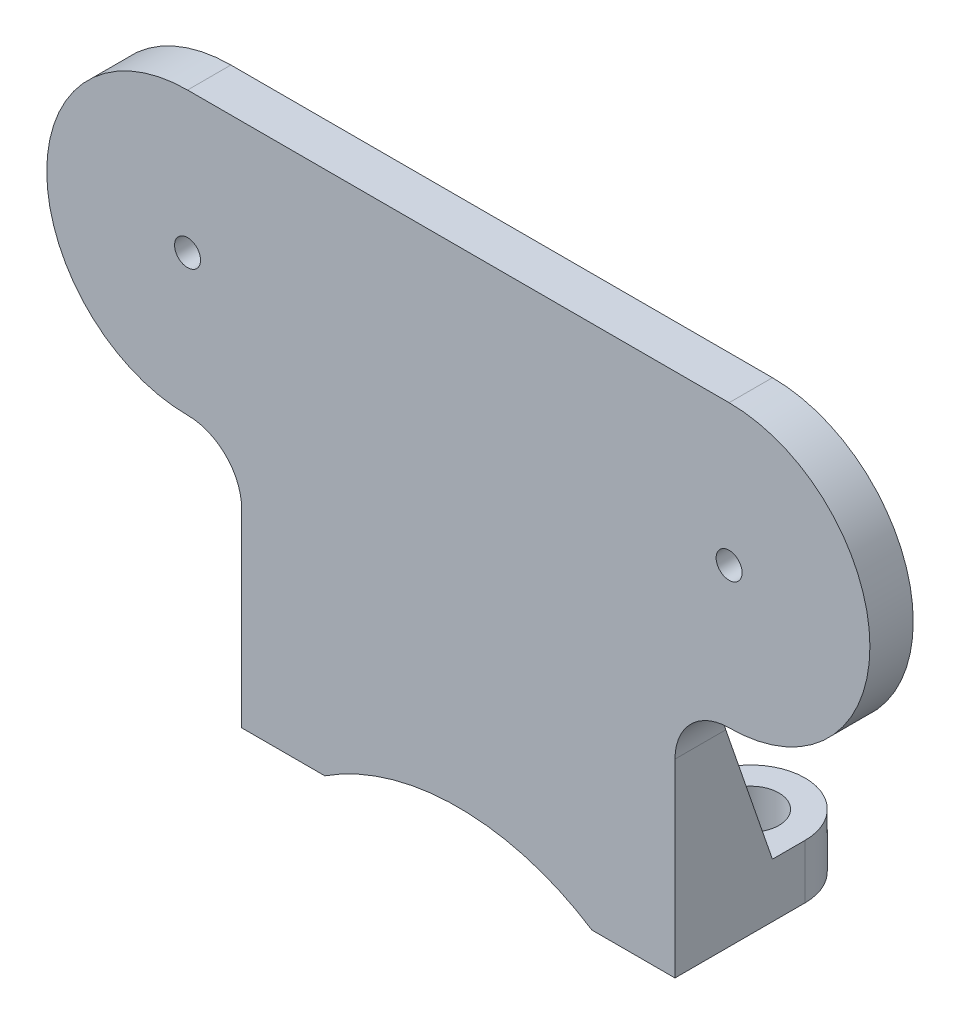
ISO-10303-21;
HEADER;
FILE_DESCRIPTION(('STEP AP214'),'2;1');
FILE_NAME('part.step','',(''),(''),'','','');
FILE_SCHEMA(('AUTOMOTIVE_DESIGN { 1 0 10303 214 1 1 1 1 }'));
ENDSEC;
DATA;
#1=APPLICATION_CONTEXT('core data for automotive mechanical design processes');
#2=APPLICATION_PROTOCOL_DEFINITION('international standard','automotive_design',2000,#1);
#3=PRODUCT_CONTEXT('',#1,'mechanical');
#4=PRODUCT('Part','Part','',(#3));
#5=PRODUCT_RELATED_PRODUCT_CATEGORY('part','',(#4));
#6=PRODUCT_DEFINITION_FORMATION('','',#4);
#7=PRODUCT_DEFINITION_CONTEXT('part definition',#1,'design');
#8=PRODUCT_DEFINITION('design','',#6,#7);
#9=PRODUCT_DEFINITION_SHAPE('','',#8);
#10=(LENGTH_UNIT() NAMED_UNIT(*) SI_UNIT(.MILLI.,.METRE.));
#11=(NAMED_UNIT(*) PLANE_ANGLE_UNIT() SI_UNIT($,.RADIAN.));
#12=(NAMED_UNIT(*) SI_UNIT($,.STERADIAN.) SOLID_ANGLE_UNIT());
#13=UNCERTAINTY_MEASURE_WITH_UNIT(LENGTH_MEASURE(1.E-05),#10,'distance_accuracy_value','');
#14=(GEOMETRIC_REPRESENTATION_CONTEXT(3) GLOBAL_UNCERTAINTY_ASSIGNED_CONTEXT((#13)) GLOBAL_UNIT_ASSIGNED_CONTEXT((#10,
#11,#12)) REPRESENTATION_CONTEXT('',''));
#15=CARTESIAN_POINT('',(0.,0.,0.));
#16=DIRECTION('',(0.,0.,1.));
#17=DIRECTION('',(1.,0.,0.));
#18=AXIS2_PLACEMENT_3D('',#15,#16,#17);
#19=CARTESIAN_POINT('',(-25.,0.,0.));
#20=DIRECTION('',(0.,0.,1.));
#21=DIRECTION('',(1.,0.,0.));
#22=AXIS2_PLACEMENT_3D('',#19,#20,#21);
#23=PLANE('',#22);
#24=CARTESIAN_POINT('',(-25.,0.,0.));
#25=DIRECTION('',(0.,0.,1.));
#26=DIRECTION('',(1.,0.,0.));
#27=AXIS2_PLACEMENT_3D('',#24,#25,#26);
#28=CIRCLE('',#27,1.2);
#29=CARTESIAN_POINT('',(-23.8,0.,0.));
#30=VERTEX_POINT('',#29);
#31=EDGE_CURVE('E497',#30,#30,#28,.T.);
#32=ORIENTED_EDGE('',*,*,#31,.T.);
#33=EDGE_LOOP('',(#32));
#34=FACE_BOUND('',#33,.T.);
#35=CARTESIAN_POINT('',(25.,0.,0.));
#36=DIRECTION('',(0.,0.,1.));
#37=DIRECTION('',(1.,0.,0.));
#38=AXIS2_PLACEMENT_3D('',#35,#36,#37);
#39=CIRCLE('',#38,1.2);
#40=CARTESIAN_POINT('',(26.2,0.,0.));
#41=VERTEX_POINT('',#40);
#42=EDGE_CURVE('E503',#41,#41,#39,.T.);
#43=ORIENTED_EDGE('',*,*,#42,.T.);
#44=EDGE_LOOP('',(#43));
#45=FACE_BOUND('',#44,.T.);
#46=DIRECTION('',(0.,1.,0.));
#47=VECTOR('',#46,1.);
#48=CARTESIAN_POINT('',(-12.,-16.,0.));
#49=LINE('',#48,#47);
#50=CARTESIAN_POINT('',(-12.,-27.5,0.));
#51=VERTEX_POINT('',#50);
#52=CARTESIAN_POINT('',(-12.,-16.,0.));
#53=VERTEX_POINT('',#52);
#54=EDGE_CURVE('E238',#51,#53,#49,.T.);
#55=ORIENTED_EDGE('',*,*,#54,.F.);
#56=DIRECTION('',(1.,0.,0.));
#57=VECTOR('',#56,1.);
#58=CARTESIAN_POINT('',(-18.,-27.5,0.));
#59=LINE('',#58,#57);
#60=CARTESIAN_POINT('',(-18.,-27.5,0.));
#61=VERTEX_POINT('',#60);
#62=EDGE_CURVE('E449',#51,#61,#59,.F.);
#63=ORIENTED_EDGE('',*,*,#62,.T.);
#64=DIRECTION('',(0.,-1.,0.));
#65=VECTOR('',#64,1.);
#66=CARTESIAN_POINT('',(-18.,-30.5,0.));
#67=LINE('',#66,#65);
#68=CARTESIAN_POINT('',(-18.,-16.,0.));
#69=VERTEX_POINT('',#68);
#70=EDGE_CURVE('E251',#69,#61,#67,.T.);
#71=ORIENTED_EDGE('',*,*,#70,.F.);
#72=DIRECTION('',(-1.,0.,0.));
#73=VECTOR('',#72,1.);
#74=CARTESIAN_POINT('',(-18.,-16.,0.));
#75=LINE('',#74,#73);
#76=CARTESIAN_POINT('',(-20.4174243050441,-16.,0.));
#77=VERTEX_POINT('',#76);
#78=EDGE_CURVE('E62',#69,#77,#75,.T.);
#79=ORIENTED_EDGE('',*,*,#78,.T.);
#80=CARTESIAN_POINT('',(-25.,-18.,0.));
#81=DIRECTION('',(0.,0.,1.));
#82=DIRECTION('',(1.,0.,0.));
#83=AXIS2_PLACEMENT_3D('',#80,#81,#82);
#84=CIRCLE('',#83,5.);
#85=CARTESIAN_POINT('',(-25.,-13.,0.));
#86=VERTEX_POINT('',#85);
#87=EDGE_CURVE('E420',#77,#86,#84,.T.);
#88=ORIENTED_EDGE('',*,*,#87,.T.);
#89=CARTESIAN_POINT('',(-25.,0.,0.));
#90=DIRECTION('',(0.,0.,1.));
#91=DIRECTION('',(1.,0.,0.));
#92=AXIS2_PLACEMENT_3D('',#89,#90,#91);
#93=CIRCLE('',#92,13.);
#94=CARTESIAN_POINT('',(-25.,13.,0.));
#95=VERTEX_POINT('',#94);
#96=EDGE_CURVE('E481',#95,#86,#93,.T.);
#97=ORIENTED_EDGE('',*,*,#96,.F.);
#98=DIRECTION('',(-1.,0.,0.));
#99=VECTOR('',#98,1.);
#100=CARTESIAN_POINT('',(-25.,13.,0.));
#101=LINE('',#100,#99);
#102=CARTESIAN_POINT('',(25.,13.,0.));
#103=VERTEX_POINT('',#102);
#104=EDGE_CURVE('E476',#103,#95,#101,.T.);
#105=ORIENTED_EDGE('',*,*,#104,.F.);
#106=CARTESIAN_POINT('',(25.,0.,0.));
#107=DIRECTION('',(0.,0.,1.));
#108=DIRECTION('',(-1.,0.,0.));
#109=AXIS2_PLACEMENT_3D('',#106,#107,#108);
#110=CIRCLE('',#109,13.);
#111=CARTESIAN_POINT('',(25.,-13.,0.));
#112=VERTEX_POINT('',#111);
#113=EDGE_CURVE('E479',#112,#103,#110,.T.);
#114=ORIENTED_EDGE('',*,*,#113,.F.);
#115=CARTESIAN_POINT('',(25.,-18.,0.));
#116=DIRECTION('',(0.,0.,1.));
#117=DIRECTION('',(1.,0.,0.));
#118=AXIS2_PLACEMENT_3D('',#115,#116,#117);
#119=CIRCLE('',#118,5.);
#120=CARTESIAN_POINT('',(20.4174243050442,-16.,0.));
#121=VERTEX_POINT('',#120);
#122=EDGE_CURVE('E419',#112,#121,#119,.T.);
#123=ORIENTED_EDGE('',*,*,#122,.T.);
#124=DIRECTION('',(1.,0.,0.));
#125=VECTOR('',#124,1.);
#126=CARTESIAN_POINT('',(18.,-16.,0.));
#127=LINE('',#126,#125);
#128=CARTESIAN_POINT('',(18.,-16.,0.));
#129=VERTEX_POINT('',#128);
#130=EDGE_CURVE('E54',#129,#121,#127,.T.);
#131=ORIENTED_EDGE('',*,*,#130,.F.);
#132=DIRECTION('',(0.,-1.,0.));
#133=VECTOR('',#132,1.);
#134=CARTESIAN_POINT('',(18.,-30.5,0.));
#135=LINE('',#134,#133);
#136=CARTESIAN_POINT('',(18.,-27.5,0.));
#137=VERTEX_POINT('',#136);
#138=EDGE_CURVE('E282',#129,#137,#135,.T.);
#139=ORIENTED_EDGE('',*,*,#138,.T.);
#140=DIRECTION('',(1.,0.,0.));
#141=VECTOR('',#140,1.);
#142=CARTESIAN_POINT('',(12.,-27.5,0.));
#143=LINE('',#142,#141);
#144=CARTESIAN_POINT('',(12.,-27.5,0.));
#145=VERTEX_POINT('',#144);
#146=EDGE_CURVE('E451',#137,#145,#143,.F.);
#147=ORIENTED_EDGE('',*,*,#146,.T.);
#148=DIRECTION('',(0.,1.,0.));
#149=VECTOR('',#148,1.);
#150=CARTESIAN_POINT('',(12.,-16.,0.));
#151=LINE('',#150,#149);
#152=CARTESIAN_POINT('',(12.,-16.,0.));
#153=VERTEX_POINT('',#152);
#154=EDGE_CURVE('E269',#145,#153,#151,.T.);
#155=ORIENTED_EDGE('',*,*,#154,.T.);
#156=DIRECTION('',(-1.,0.,0.));
#157=VECTOR('',#156,1.);
#158=CARTESIAN_POINT('',(12.,-16.,0.));
#159=LINE('',#158,#157);
#160=CARTESIAN_POINT('',(9.99999999999996,-16.,0.));
#161=VERTEX_POINT('',#160);
#162=EDGE_CURVE('E274',#153,#161,#159,.T.);
#163=ORIENTED_EDGE('',*,*,#162,.T.);
#164=DIRECTION('',(0.,-1.,0.));
#165=VECTOR('',#164,1.);
#166=CARTESIAN_POINT('',(9.99999999999996,-30.5,0.));
#167=LINE('',#166,#165);
#168=CARTESIAN_POINT('',(9.99999999999996,-34.1770449983276,0.));
#169=VERTEX_POINT('',#168);
#170=EDGE_CURVE('E506',#161,#169,#167,.T.);
#171=ORIENTED_EDGE('',*,*,#170,.T.);
#172=CARTESIAN_POINT('',(0.,-54.5,0.));
#173=DIRECTION('',(0.,0.,1.));
#174=DIRECTION('',(1.,0.,0.));
#175=AXIS2_PLACEMENT_3D('',#172,#173,#174);
#176=CIRCLE('',#175,22.65);
#177=CARTESIAN_POINT('',(-9.99999999999995,-34.1770449983276,0.));
#178=VERTEX_POINT('',#177);
#179=EDGE_CURVE('E311',#178,#169,#176,.F.);
#180=ORIENTED_EDGE('',*,*,#179,.F.);
#181=DIRECTION('',(0.,-1.,0.));
#182=VECTOR('',#181,1.);
#183=CARTESIAN_POINT('',(-9.99999999999996,-30.5,0.));
#184=LINE('',#183,#182);
#185=CARTESIAN_POINT('',(-9.99999999999996,-16.,0.));
#186=VERTEX_POINT('',#185);
#187=EDGE_CURVE('E533',#186,#178,#184,.T.);
#188=ORIENTED_EDGE('',*,*,#187,.F.);
#189=DIRECTION('',(1.,0.,0.));
#190=VECTOR('',#189,1.);
#191=CARTESIAN_POINT('',(-12.,-16.,0.));
#192=LINE('',#191,#190);
#193=EDGE_CURVE('E237',#53,#186,#192,.T.);
#194=ORIENTED_EDGE('',*,*,#193,.F.);
#195=EDGE_LOOP('',(#55,#63,#71,#79,#88,#97,#105,#114,#123,#131,#139,#147,#155,#163,#171,#180,
#188,#194));
#196=FACE_BOUND('',#195,.T.);
#197=ADVANCED_FACE('F39',(#34,#45,#196),#23,.F.);
#198=CARTESIAN_POINT('',(0.,-30.5,0.));
#199=DIRECTION('',(0.,-1.,0.));
#200=DIRECTION('',(0.,0.,-1.));
#201=AXIS2_PLACEMENT_3D('',#198,#199,#200);
#202=PLANE('',#201);
#203=CARTESIAN_POINT('',(-15.,-30.5,-7.99999999999997));
#204=DIRECTION('',(0.,-1.,0.));
#205=DIRECTION('',(0.,0.,-1.));
#206=AXIS2_PLACEMENT_3D('',#203,#204,#205);
#207=CIRCLE('',#206,2.59999999999995);
#208=CARTESIAN_POINT('',(-15.,-30.5,-10.5999999999999));
#209=VERTEX_POINT('',#208);
#210=EDGE_CURVE('E534',#209,#209,#207,.T.);
#211=ORIENTED_EDGE('',*,*,#210,.T.);
#212=EDGE_LOOP('',(#211));
#213=FACE_BOUND('',#212,.T.);
#214=DIRECTION('',(0.,0.,-1.));
#215=VECTOR('',#214,1.);
#216=CARTESIAN_POINT('',(-18.,-30.5,-5.));
#217=LINE('',#216,#215);
#218=CARTESIAN_POINT('',(-18.,-30.5,-3.));
#219=VERTEX_POINT('',#218);
#220=CARTESIAN_POINT('',(-18.,-30.5,-5.));
#221=VERTEX_POINT('',#220);
#222=EDGE_CURVE('E257',#219,#221,#217,.T.);
#223=ORIENTED_EDGE('',*,*,#222,.F.);
#224=DIRECTION('',(1.,0.,0.));
#225=VECTOR('',#224,1.);
#226=CARTESIAN_POINT('',(-12.,-30.5,-3.));
#227=LINE('',#226,#225);
#228=CARTESIAN_POINT('',(-12.,-30.5,-3.));
#229=VERTEX_POINT('',#228);
#230=EDGE_CURVE('E455',#219,#229,#227,.T.);
#231=ORIENTED_EDGE('',*,*,#230,.T.);
#232=DIRECTION('',(0.,0.,1.));
#233=VECTOR('',#232,1.);
#234=CARTESIAN_POINT('',(-12.,-30.5,0.));
#235=LINE('',#234,#233);
#236=CARTESIAN_POINT('',(-12.,-30.5,-5.));
#237=VERTEX_POINT('',#236);
#238=EDGE_CURVE('E233',#237,#229,#235,.T.);
#239=ORIENTED_EDGE('',*,*,#238,.F.);
#240=DIRECTION('',(1.,0.,0.));
#241=VECTOR('',#240,1.);
#242=CARTESIAN_POINT('',(-12.,-30.5,-5.));
#243=LINE('',#242,#241);
#244=CARTESIAN_POINT('',(-9.99999999999995,-30.5,-5.));
#245=VERTEX_POINT('',#244);
#246=EDGE_CURVE('E228',#237,#245,#243,.T.);
#247=ORIENTED_EDGE('',*,*,#246,.T.);
#248=DIRECTION('',(0.,0.,-1.));
#249=VECTOR('',#248,1.);
#250=CARTESIAN_POINT('',(-9.99999999999996,-30.5,0.));
#251=LINE('',#250,#249);
#252=CARTESIAN_POINT('',(-9.99999999999995,-30.5,-7.99999999999997));
#253=VERTEX_POINT('',#252);
#254=EDGE_CURVE('E212',#245,#253,#251,.T.);
#255=ORIENTED_EDGE('',*,*,#254,.T.);
#256=CARTESIAN_POINT('',(-15.,-30.5,-7.99999999999997));
#257=DIRECTION('',(0.,-1.,0.));
#258=DIRECTION('',(0.,0.,-1.));
#259=AXIS2_PLACEMENT_3D('',#256,#257,#258);
#260=CIRCLE('',#259,5.);
#261=CARTESIAN_POINT('',(-20.,-30.5,-7.99999999999997));
#262=VERTEX_POINT('',#261);
#263=EDGE_CURVE('E225',#253,#262,#260,.F.);
#264=ORIENTED_EDGE('',*,*,#263,.T.);
#265=DIRECTION('',(0.,0.,1.));
#266=VECTOR('',#265,1.);
#267=CARTESIAN_POINT('',(-20.,-30.5,-1.30104260698261E-13));
#268=LINE('',#267,#266);
#269=CARTESIAN_POINT('',(-20.,-30.5,-5.));
#270=VERTEX_POINT('',#269);
#271=EDGE_CURVE('E224',#262,#270,#268,.T.);
#272=ORIENTED_EDGE('',*,*,#271,.T.);
#273=DIRECTION('',(-1.,0.,0.));
#274=VECTOR('',#273,1.);
#275=CARTESIAN_POINT('',(-18.,-30.5,-5.));
#276=LINE('',#275,#274);
#277=EDGE_CURVE('E261',#221,#270,#276,.T.);
#278=ORIENTED_EDGE('',*,*,#277,.F.);
#279=EDGE_LOOP('',(#223,#231,#239,#247,#255,#264,#272,#278));
#280=FACE_BOUND('',#279,.T.);
#281=ADVANCED_FACE('F230',(#213,#280),#202,.F.);
#282=CARTESIAN_POINT('',(-25.,0.,4.));
#283=DIRECTION('',(0.,0.,1.));
#284=DIRECTION('',(1.,0.,0.));
#285=AXIS2_PLACEMENT_3D('',#282,#283,#284);
#286=PLANE('',#285);
#287=CARTESIAN_POINT('',(-25.,0.,4.));
#288=DIRECTION('',(0.,0.,1.));
#289=DIRECTION('',(1.,0.,0.));
#290=AXIS2_PLACEMENT_3D('',#287,#288,#289);
#291=CIRCLE('',#290,1.2);
#292=CARTESIAN_POINT('',(-23.8,0.,4.));
#293=VERTEX_POINT('',#292);
#294=EDGE_CURVE('E484',#293,#293,#291,.T.);
#295=ORIENTED_EDGE('',*,*,#294,.F.);
#296=EDGE_LOOP('',(#295));
#297=FACE_BOUND('',#296,.T.);
#298=CARTESIAN_POINT('',(25.,0.,4.));
#299=DIRECTION('',(0.,0.,1.));
#300=DIRECTION('',(1.,0.,0.));
#301=AXIS2_PLACEMENT_3D('',#298,#299,#300);
#302=CIRCLE('',#301,1.2);
#303=CARTESIAN_POINT('',(26.2,0.,4.));
#304=VERTEX_POINT('',#303);
#305=EDGE_CURVE('E500',#304,#304,#302,.T.);
#306=ORIENTED_EDGE('',*,*,#305,.F.);
#307=EDGE_LOOP('',(#306));
#308=FACE_BOUND('',#307,.T.);
#309=DIRECTION('',(1.,0.,0.));
#310=VECTOR('',#309,1.);
#311=CARTESIAN_POINT('',(-15.,-35.5,4.));
#312=LINE('',#311,#310);
#313=CARTESIAN_POINT('',(-20.,-35.5,4.));
#314=VERTEX_POINT('',#313);
#315=CARTESIAN_POINT('',(-12.329740467666,-35.5,4.));
#316=VERTEX_POINT('',#315);
#317=EDGE_CURVE('E490',#314,#316,#312,.T.);
#318=ORIENTED_EDGE('',*,*,#317,.T.);
#319=CARTESIAN_POINT('',(0.,-54.5,4.));
#320=DIRECTION('',(0.,0.,1.));
#321=DIRECTION('',(1.,0.,0.));
#322=AXIS2_PLACEMENT_3D('',#319,#320,#321);
#323=CIRCLE('',#322,22.65);
#324=CARTESIAN_POINT('',(12.329740467666,-35.5,4.));
#325=VERTEX_POINT('',#324);
#326=EDGE_CURVE('E293',#316,#325,#323,.F.);
#327=ORIENTED_EDGE('',*,*,#326,.T.);
#328=CARTESIAN_POINT('',(20.,-35.5,4.));
#329=VERTEX_POINT('',#328);
#330=EDGE_CURVE('E493',#325,#329,#312,.T.);
#331=ORIENTED_EDGE('',*,*,#330,.T.);
#332=DIRECTION('',(0.,1.,0.));
#333=VECTOR('',#332,1.);
#334=CARTESIAN_POINT('',(20.,-13.,4.));
#335=LINE('',#334,#333);
#336=CARTESIAN_POINT('',(20.,-18.,4.));
#337=VERTEX_POINT('',#336);
#338=EDGE_CURVE('E488',#329,#337,#335,.T.);
#339=ORIENTED_EDGE('',*,*,#338,.T.);
#340=CARTESIAN_POINT('',(25.,-18.,4.));
#341=DIRECTION('',(0.,0.,1.));
#342=DIRECTION('',(1.,0.,0.));
#343=AXIS2_PLACEMENT_3D('',#340,#341,#342);
#344=CIRCLE('',#343,5.);
#345=CARTESIAN_POINT('',(25.,-13.,4.));
#346=VERTEX_POINT('',#345);
#347=EDGE_CURVE('E11',#337,#346,#344,.F.);
#348=ORIENTED_EDGE('',*,*,#347,.T.);
#349=CARTESIAN_POINT('',(25.,0.,4.));
#350=DIRECTION('',(0.,0.,1.));
#351=DIRECTION('',(-1.,0.,0.));
#352=AXIS2_PLACEMENT_3D('',#349,#350,#351);
#353=CIRCLE('',#352,13.);
#354=CARTESIAN_POINT('',(25.,13.,4.));
#355=VERTEX_POINT('',#354);
#356=EDGE_CURVE('E486',#346,#355,#353,.T.);
#357=ORIENTED_EDGE('',*,*,#356,.T.);
#358=DIRECTION('',(-1.,0.,0.));
#359=VECTOR('',#358,1.);
#360=CARTESIAN_POINT('',(-25.,13.,4.));
#361=LINE('',#360,#359);
#362=CARTESIAN_POINT('',(-25.,13.,4.));
#363=VERTEX_POINT('',#362);
#364=EDGE_CURVE('E475',#355,#363,#361,.T.);
#365=ORIENTED_EDGE('',*,*,#364,.T.);
#366=CARTESIAN_POINT('',(-25.,0.,4.));
#367=DIRECTION('',(0.,0.,1.));
#368=DIRECTION('',(1.,0.,0.));
#369=AXIS2_PLACEMENT_3D('',#366,#367,#368);
#370=CIRCLE('',#369,13.);
#371=CARTESIAN_POINT('',(-25.,-13.,4.));
#372=VERTEX_POINT('',#371);
#373=EDGE_CURVE('E478',#363,#372,#370,.T.);
#374=ORIENTED_EDGE('',*,*,#373,.T.);
#375=CARTESIAN_POINT('',(-25.,-18.,4.));
#376=DIRECTION('',(0.,0.,1.));
#377=DIRECTION('',(1.,0.,0.));
#378=AXIS2_PLACEMENT_3D('',#375,#376,#377);
#379=CIRCLE('',#378,5.);
#380=CARTESIAN_POINT('',(-20.,-18.,4.));
#381=VERTEX_POINT('',#380);
#382=EDGE_CURVE('E411',#372,#381,#379,.F.);
#383=ORIENTED_EDGE('',*,*,#382,.T.);
#384=DIRECTION('',(0.,-1.,0.));
#385=VECTOR('',#384,1.);
#386=CARTESIAN_POINT('',(-20.,-13.,4.));
#387=LINE('',#386,#385);
#388=EDGE_CURVE('E494',#381,#314,#387,.T.);
#389=ORIENTED_EDGE('',*,*,#388,.T.);
#390=EDGE_LOOP('',(#318,#327,#331,#339,#348,#357,#365,#374,#383,#389));
#391=FACE_BOUND('',#390,.T.);
#392=ADVANCED_FACE('F363',(#297,#308,#391),#286,.T.);
#393=CARTESIAN_POINT('',(15.,-35.5,4.));
#394=DIRECTION('',(0.,1.,0.));
#395=DIRECTION('',(-1.,0.,0.));
#396=AXIS2_PLACEMENT_3D('',#393,#394,#395);
#397=PLANE('',#396);
#398=CARTESIAN_POINT('',(-15.,-35.5,-7.99999999999997));
#399=DIRECTION('',(0.,-1.,0.));
#400=DIRECTION('',(0.,0.,-1.));
#401=AXIS2_PLACEMENT_3D('',#398,#399,#400);
#402=CIRCLE('',#401,2.59999999999995);
#403=CARTESIAN_POINT('',(-15.,-35.5,-10.5999999999999));
#404=VERTEX_POINT('',#403);
#405=EDGE_CURVE('E538',#404,#404,#402,.T.);
#406=ORIENTED_EDGE('',*,*,#405,.F.);
#407=EDGE_LOOP('',(#406));
#408=FACE_BOUND('',#407,.T.);
#409=DIRECTION('',(0.,0.,1.));
#410=VECTOR('',#409,1.);
#411=CARTESIAN_POINT('',(-12.329740467666,-35.5,-13.));
#412=LINE('',#411,#410);
#413=CARTESIAN_POINT('',(-12.329740467666,-35.5,-12.2272584531797));
#414=VERTEX_POINT('',#413);
#415=EDGE_CURVE('E298',#414,#316,#412,.T.);
#416=ORIENTED_EDGE('',*,*,#415,.T.);
#417=ORIENTED_EDGE('',*,*,#317,.F.);
#418=DIRECTION('',(0.,0.,-1.));
#419=VECTOR('',#418,1.);
#420=CARTESIAN_POINT('',(-20.,-35.5,4.));
#421=LINE('',#420,#419);
#422=CARTESIAN_POINT('',(-20.,-35.5,-7.99999999999997));
#423=VERTEX_POINT('',#422);
#424=EDGE_CURVE('E460',#314,#423,#421,.T.);
#425=ORIENTED_EDGE('',*,*,#424,.T.);
#426=CARTESIAN_POINT('',(-15.,-35.5,-7.99999999999997));
#427=DIRECTION('',(0.,-1.,0.));
#428=DIRECTION('',(0.,0.,-1.));
#429=AXIS2_PLACEMENT_3D('',#426,#427,#428);
#430=CIRCLE('',#429,5.);
#431=EDGE_CURVE('E337',#414,#423,#430,.F.);
#432=ORIENTED_EDGE('',*,*,#431,.F.);
#433=EDGE_LOOP('',(#416,#417,#425,#432));
#434=FACE_BOUND('',#433,.T.);
#435=ADVANCED_FACE('F366',(#408,#434),#397,.F.);
#436=CARTESIAN_POINT('',(15.,-35.5,-7.99999999999998));
#437=DIRECTION('',(0.,-1.,0.));
#438=DIRECTION('',(0.,0.,-1.));
#439=AXIS2_PLACEMENT_3D('',#436,#437,#438);
#440=CIRCLE('',#439,2.59999999999995);
#441=CARTESIAN_POINT('',(15.,-35.5,-10.5999999999999));
#442=VERTEX_POINT('',#441);
#443=EDGE_CURVE('E520',#442,#442,#440,.T.);
#444=ORIENTED_EDGE('',*,*,#443,.F.);
#445=EDGE_LOOP('',(#444));
#446=FACE_BOUND('',#445,.T.);
#447=DIRECTION('',(0.,0.,1.));
#448=VECTOR('',#447,1.);
#449=CARTESIAN_POINT('',(12.329740467666,-35.5,-13.));
#450=LINE('',#449,#448);
#451=CARTESIAN_POINT('',(12.329740467666,-35.5,-12.2272584531797));
#452=VERTEX_POINT('',#451);
#453=EDGE_CURVE('E301',#452,#325,#450,.T.);
#454=ORIENTED_EDGE('',*,*,#453,.F.);
#455=CARTESIAN_POINT('',(15.,-35.5,-7.99999999999998));
#456=DIRECTION('',(0.,-1.,0.));
#457=DIRECTION('',(0.,0.,-1.));
#458=AXIS2_PLACEMENT_3D('',#455,#456,#457);
#459=CIRCLE('',#458,5.);
#460=CARTESIAN_POINT('',(20.,-35.5,-7.99999999999997));
#461=VERTEX_POINT('',#460);
#462=EDGE_CURVE('E517',#452,#461,#459,.T.);
#463=ORIENTED_EDGE('',*,*,#462,.T.);
#464=DIRECTION('',(0.,0.,-1.));
#465=VECTOR('',#464,1.);
#466=CARTESIAN_POINT('',(20.,-35.5,4.));
#467=LINE('',#466,#465);
#468=EDGE_CURVE('E463',#329,#461,#467,.T.);
#469=ORIENTED_EDGE('',*,*,#468,.F.);
#470=ORIENTED_EDGE('',*,*,#330,.F.);
#471=EDGE_LOOP('',(#454,#463,#469,#470));
#472=FACE_BOUND('',#471,.T.);
#473=ADVANCED_FACE('F348',(#446,#472),#397,.F.);
#474=CARTESIAN_POINT('',(9.99999999999996,-30.5,0.));
#475=DIRECTION('',(-1.,0.,0.));
#476=DIRECTION('',(0.,0.,1.));
#477=AXIS2_PLACEMENT_3D('',#474,#475,#476);
#478=PLANE('',#477);
#479=DIRECTION('',(0.,-1.,0.));
#480=VECTOR('',#479,1.);
#481=CARTESIAN_POINT('',(9.99999999999995,-30.5,-7.99999999999997));
#482=LINE('',#481,#480);
#483=CARTESIAN_POINT('',(9.99999999999995,-30.5,-7.99999999999997));
#484=VERTEX_POINT('',#483);
#485=CARTESIAN_POINT('',(9.99999999999995,-34.1770449983276,-7.99999999999997));
#486=VERTEX_POINT('',#485);
#487=EDGE_CURVE('E509',#484,#486,#482,.T.);
#488=ORIENTED_EDGE('',*,*,#487,.T.);
#489=DIRECTION('',(0.,0.,1.));
#490=VECTOR('',#489,1.);
#491=CARTESIAN_POINT('',(9.99999999999995,-34.1770449983276,-13.));
#492=LINE('',#491,#490);
#493=EDGE_CURVE('E338',#486,#169,#492,.T.);
#494=ORIENTED_EDGE('',*,*,#493,.T.);
#495=ORIENTED_EDGE('',*,*,#170,.F.);
#496=DIRECTION('',(0.,-0.945372981626273,-0.325990683319403));
#497=VECTOR('',#496,1.);
#498=CARTESIAN_POINT('',(9.99999999999995,-30.5,-5.));
#499=LINE('',#498,#497);
#500=CARTESIAN_POINT('',(9.99999999999995,-30.5,-5.));
#501=VERTEX_POINT('',#500);
#502=EDGE_CURVE('E264',#161,#501,#499,.T.);
#503=ORIENTED_EDGE('',*,*,#502,.T.);
#504=DIRECTION('',(0.,0.,-1.));
#505=VECTOR('',#504,1.);
#506=CARTESIAN_POINT('',(9.99999999999996,-30.5,0.));
#507=LINE('',#506,#505);
#508=EDGE_CURVE('E528',#501,#484,#507,.T.);
#509=ORIENTED_EDGE('',*,*,#508,.T.);
#510=EDGE_LOOP('',(#488,#494,#495,#503,#509));
#511=FACE_BOUND('',#510,.T.);
#512=ADVANCED_FACE('F343',(#511),#478,.T.);
#513=CARTESIAN_POINT('',(15.,-30.5,-7.99999999999998));
#514=DIRECTION('',(0.,-1.,0.));
#515=DIRECTION('',(0.,0.,-1.));
#516=AXIS2_PLACEMENT_3D('',#513,#514,#515);
#517=CYLINDRICAL_SURFACE('',#516,5.);
#518=ORIENTED_EDGE('',*,*,#462,.F.);
#519=CARTESIAN_POINT('',(12.329740467666,-35.5,-12.2272584531797));
#520=CARTESIAN_POINT('',(12.2225293587096,-35.4304160792958,-12.1595533242041));
#521=CARTESIAN_POINT('',(12.1168164568644,-35.3631159991764,-12.0870538373283));
#522=CARTESIAN_POINT('',(11.9093677369786,-35.2333363393609,-11.9325175155678));
#523=CARTESIAN_POINT('',(11.8076343095939,-35.1708596360003,-11.8504750618851));
#524=CARTESIAN_POINT('',(11.6089905048057,-35.0509031353264,-11.6767535996554));
#525=CARTESIAN_POINT('',(11.5120936885644,-34.9934370837892,-11.5850495177509));
#526=CARTESIAN_POINT('',(11.324536341671,-34.883956550203,-11.3924952280118));
#527=CARTESIAN_POINT('',(11.233874614534,-34.8319410212153,-11.291646783598));
#528=CARTESIAN_POINT('',(11.059483392532,-34.7333510552124,-11.0807679509366));
#529=CARTESIAN_POINT('',(10.9757864979267,-34.6868018279059,-10.9706987466644));
#530=CARTESIAN_POINT('',(10.8168302695518,-34.5995751387638,-10.7423442671521));
#531=CARTESIAN_POINT('',(10.7415749433503,-34.5589004632125,-10.6240551323589));
#532=CARTESIAN_POINT('',(10.6007455324804,-34.4836802417533,-10.3804014194787));
#533=CARTESIAN_POINT('',(10.5351484567578,-34.4491200995374,-10.2550546593192));
#534=CARTESIAN_POINT('',(10.4143749517426,-34.3861258372422,-9.9980469704045));
#535=CARTESIAN_POINT('',(10.35919277949,-34.3576883398046,-9.8663895719679));
#536=CARTESIAN_POINT('',(10.2592627612153,-34.3066042527945,-9.59578141945735));
#537=CARTESIAN_POINT('',(10.2146820768777,-34.284049952961,-9.4567513804151));
#538=CARTESIAN_POINT('',(10.1376973386246,-34.2453353721974,-9.17448731225828));
#539=CARTESIAN_POINT('',(10.1052934801008,-34.2291751938685,-9.03125321572428));
#540=CARTESIAN_POINT('',(10.0529653173175,-34.2031701644359,-8.74078826064109));
#541=CARTESIAN_POINT('',(10.0331407161336,-34.1933757538764,-8.59353488876485));
#542=CARTESIAN_POINT('',(10.0066377214013,-34.1803115894766,-8.29752430262395));
#543=CARTESIAN_POINT('',(9.99996288730794,-34.1770436022431,-8.14876669213286));
#544=CARTESIAN_POINT('',(10.,-34.1770449983276,-7.99999999999997));
#545=B_SPLINE_CURVE_WITH_KNOTS('',3,(#519,#520,#521,#522,#523,#524,#525,#526,#527,#528,#529,
#530,#531,#532,#533,#534,#535,#536,#537,#538,#539,#540,#541,#542,#543,#544),.UNSPECIFIED.,.F.,
.F.,(4,2,2,2,2,2,2,2,2,2,2,2,4),(0.,0.433861914551858,0.867980587969875,1.30325499011313,
1.73844563069135,2.17557042318189,2.61290186670019,3.04917481909605,3.48520649557289,
3.9277147964524,4.37023019760903,4.81621054617655,5.26231159870277),.UNSPECIFIED.);
#546=EDGE_CURVE('E329',#452,#486,#545,.T.);
#547=ORIENTED_EDGE('',*,*,#546,.T.);
#548=ORIENTED_EDGE('',*,*,#487,.F.);
#549=CARTESIAN_POINT('',(15.,-30.5,-7.99999999999998));
#550=DIRECTION('',(0.,-1.,0.));
#551=DIRECTION('',(0.,0.,-1.));
#552=AXIS2_PLACEMENT_3D('',#549,#550,#551);
#553=CIRCLE('',#552,5.);
#554=CARTESIAN_POINT('',(20.,-30.5,-7.99999999999997));
#555=VERTEX_POINT('',#554);
#556=EDGE_CURVE('E525',#484,#555,#553,.T.);
#557=ORIENTED_EDGE('',*,*,#556,.T.);
#558=DIRECTION('',(0.,-1.,0.));
#559=VECTOR('',#558,1.);
#560=CARTESIAN_POINT('',(20.,-30.5,-7.99999999999997));
#561=LINE('',#560,#559);
#562=EDGE_CURVE('E512',#555,#461,#561,.T.);
#563=ORIENTED_EDGE('',*,*,#562,.T.);
#564=EDGE_LOOP('',(#518,#547,#548,#557,#563));
#565=FACE_BOUND('',#564,.T.);
#566=ADVANCED_FACE('F339',(#565),#517,.T.);
#567=CARTESIAN_POINT('',(-15.,-30.5,-7.99999999999997));
#568=DIRECTION('',(0.,-1.,0.));
#569=DIRECTION('',(0.,0.,-1.));
#570=AXIS2_PLACEMENT_3D('',#567,#568,#569);
#571=CYLINDRICAL_SURFACE('',#570,5.);
#572=CARTESIAN_POINT('',(-12.329740467666,-35.5,-12.2272584531797));
#573=CARTESIAN_POINT('',(-12.2225293587095,-35.4304160792958,-12.1595533242041));
#574=CARTESIAN_POINT('',(-12.1168164568643,-35.3631159991764,-12.0870538373283));
#575=CARTESIAN_POINT('',(-11.9093677369785,-35.2333363393609,-11.9325175155678));
#576=CARTESIAN_POINT('',(-11.8076343095938,-35.1708596360003,-11.8504750618851));
#577=CARTESIAN_POINT('',(-11.6089905048056,-35.0509031353264,-11.6767535996554));
#578=CARTESIAN_POINT('',(-11.5120936885644,-34.9934370837892,-11.5850495177509));
#579=CARTESIAN_POINT('',(-11.3245363416709,-34.883956550203,-11.3924952280117));
#580=CARTESIAN_POINT('',(-11.2338746145339,-34.8319410212153,-11.291646783598));
#581=CARTESIAN_POINT('',(-11.0594833925319,-34.7333510552124,-11.0807679509366));
#582=CARTESIAN_POINT('',(-10.9757864979266,-34.686801827906,-10.9706987466644));
#583=CARTESIAN_POINT('',(-10.8168302695517,-34.5995751387638,-10.7423442671521));
#584=CARTESIAN_POINT('',(-10.7415749433502,-34.5589004632125,-10.6240551323589));
#585=CARTESIAN_POINT('',(-10.6007455324803,-34.4836802417533,-10.3804014194787));
#586=CARTESIAN_POINT('',(-10.5351484567578,-34.4491200995374,-10.2550546593191));
#587=CARTESIAN_POINT('',(-10.4143749517426,-34.3861258372423,-9.99804697040449));
#588=CARTESIAN_POINT('',(-10.3591927794899,-34.3576883398046,-9.86638957196789));
#589=CARTESIAN_POINT('',(-10.2592627612152,-34.3066042527945,-9.59578141945734));
#590=CARTESIAN_POINT('',(-10.2146820768777,-34.284049952961,-9.45675138041509));
#591=CARTESIAN_POINT('',(-10.1376973386245,-34.2453353721974,-9.17448731225827));
#592=CARTESIAN_POINT('',(-10.1052934801008,-34.2291751938685,-9.03125321572428));
#593=CARTESIAN_POINT('',(-10.0529653173174,-34.2031701644359,-8.74078826064109));
#594=CARTESIAN_POINT('',(-10.0331407161335,-34.1933757538764,-8.59353488876485));
#595=CARTESIAN_POINT('',(-10.0066377214013,-34.1803115894766,-8.29752430262395));
#596=CARTESIAN_POINT('',(-9.99996288730787,-34.1770436022431,-8.14876669213286));
#597=CARTESIAN_POINT('',(-9.99999999999995,-34.1770449983276,-7.99999999999997));
#598=B_SPLINE_CURVE_WITH_KNOTS('',3,(#572,#573,#574,#575,#576,#577,#578,#579,#580,#581,#582,
#583,#584,#585,#586,#587,#588,#589,#590,#591,#592,#593,#594,#595,#596,#597),.UNSPECIFIED.,.F.,
.F.,(4,2,2,2,2,2,2,2,2,2,2,2,4),(0.,0.433861914551856,0.867980587969874,1.30325499011312,
1.73844563069134,2.17557042318188,2.61290186670017,3.04917481909603,3.48520649557287,
3.92771479645238,4.370230197609,4.81621054617652,5.26231159870274),.UNSPECIFIED.);
#599=CARTESIAN_POINT('',(-9.99999999999995,-34.1770449983276,-7.99999999999997));
#600=VERTEX_POINT('',#599);
#601=EDGE_CURVE('E303',#414,#600,#598,.T.);
#602=ORIENTED_EDGE('',*,*,#601,.F.);
#603=ORIENTED_EDGE('',*,*,#431,.T.);
#604=DIRECTION('',(0.,-1.,0.));
#605=VECTOR('',#604,1.);
#606=CARTESIAN_POINT('',(-20.,-30.5,-7.99999999999997));
#607=LINE('',#606,#605);
#608=EDGE_CURVE('E523',#262,#423,#607,.T.);
#609=ORIENTED_EDGE('',*,*,#608,.F.);
#610=ORIENTED_EDGE('',*,*,#263,.F.);
#611=DIRECTION('',(0.,-1.,0.));
#612=VECTOR('',#611,1.);
#613=CARTESIAN_POINT('',(-9.99999999999995,-30.5,-7.99999999999997));
#614=LINE('',#613,#612);
#615=EDGE_CURVE('E220',#253,#600,#614,.T.);
#616=ORIENTED_EDGE('',*,*,#615,.T.);
#617=EDGE_LOOP('',(#602,#603,#609,#610,#616));
#618=FACE_BOUND('',#617,.T.);
#619=ADVANCED_FACE('F313',(#618),#571,.T.);
#620=CARTESIAN_POINT('',(-9.99999999999996,-30.5,0.));
#621=DIRECTION('',(-1.,0.,0.));
#622=DIRECTION('',(0.,0.,1.));
#623=AXIS2_PLACEMENT_3D('',#620,#621,#622);
#624=PLANE('',#623);
#625=DIRECTION('',(0.,0.,1.));
#626=VECTOR('',#625,1.);
#627=CARTESIAN_POINT('',(-9.99999999999995,-34.1770449983276,-13.));
#628=LINE('',#627,#626);
#629=EDGE_CURVE('E457',#600,#178,#628,.T.);
#630=ORIENTED_EDGE('',*,*,#629,.F.);
#631=ORIENTED_EDGE('',*,*,#615,.F.);
#632=ORIENTED_EDGE('',*,*,#254,.F.);
#633=DIRECTION('',(0.,-0.945372981626273,-0.325990683319403));
#634=VECTOR('',#633,1.);
#635=CARTESIAN_POINT('',(-9.99999999999995,-30.5,-5.));
#636=LINE('',#635,#634);
#637=EDGE_CURVE('E218',#186,#245,#636,.T.);
#638=ORIENTED_EDGE('',*,*,#637,.F.);
#639=ORIENTED_EDGE('',*,*,#187,.T.);
#640=EDGE_LOOP('',(#630,#631,#632,#638,#639));
#641=FACE_BOUND('',#640,.T.);
#642=ADVANCED_FACE('F215',(#641),#624,.F.);
#643=CARTESIAN_POINT('',(-25.,0.,4.));
#644=DIRECTION('',(0.,0.,-1.));
#645=DIRECTION('',(-1.,0.,0.));
#646=AXIS2_PLACEMENT_3D('',#643,#644,#645);
#647=CYLINDRICAL_SURFACE('',#646,13.);
#648=ORIENTED_EDGE('',*,*,#96,.T.);
#649=DIRECTION('',(0.,0.,-1.));
#650=VECTOR('',#649,1.);
#651=CARTESIAN_POINT('',(-25.,-13.,4.));
#652=LINE('',#651,#650);
#653=EDGE_CURVE('E414',#372,#86,#652,.T.);
#654=ORIENTED_EDGE('',*,*,#653,.F.);
#655=ORIENTED_EDGE('',*,*,#373,.F.);
#656=DIRECTION('',(0.,0.,-1.));
#657=VECTOR('',#656,1.);
#658=CARTESIAN_POINT('',(-25.,13.,4.));
#659=LINE('',#658,#657);
#660=EDGE_CURVE('E472',#363,#95,#659,.T.);
#661=ORIENTED_EDGE('',*,*,#660,.T.);
#662=EDGE_LOOP('',(#648,#654,#655,#661));
#663=FACE_BOUND('',#662,.T.);
#664=ADVANCED_FACE('F388',(#663),#647,.T.);
#665=CARTESIAN_POINT('',(-20.,-13.,4.));
#666=DIRECTION('',(1.,0.,0.));
#667=DIRECTION('',(0.,0.,-1.));
#668=AXIS2_PLACEMENT_3D('',#665,#666,#667);
#669=PLANE('',#668);
#670=ORIENTED_EDGE('',*,*,#388,.F.);
#671=DIRECTION('',(0.,0.,-1.));
#672=VECTOR('',#671,1.);
#673=CARTESIAN_POINT('',(-20.,-18.,0.));
#674=LINE('',#673,#672);
#675=CARTESIAN_POINT('',(-20.,-18.,-0.689655172413795));
#676=VERTEX_POINT('',#675);
#677=EDGE_CURVE('E416',#381,#676,#674,.T.);
#678=ORIENTED_EDGE('',*,*,#677,.T.);
#679=DIRECTION('',(0.,0.945372981626273,0.325990683319403));
#680=VECTOR('',#679,1.);
#681=CARTESIAN_POINT('',(-20.,-16.,0.));
#682=LINE('',#681,#680);
#683=EDGE_CURVE('E249',#270,#676,#682,.T.);
#684=ORIENTED_EDGE('',*,*,#683,.F.);
#685=ORIENTED_EDGE('',*,*,#271,.F.);
#686=ORIENTED_EDGE('',*,*,#608,.T.);
#687=ORIENTED_EDGE('',*,*,#424,.F.);
#688=EDGE_LOOP('',(#670,#678,#684,#685,#686,#687));
#689=FACE_BOUND('',#688,.T.);
#690=ADVANCED_FACE('F381',(#689),#669,.F.);
#691=CARTESIAN_POINT('',(20.,-13.,4.));
#692=DIRECTION('',(-1.,0.,0.));
#693=DIRECTION('',(0.,0.,1.));
#694=AXIS2_PLACEMENT_3D('',#691,#692,#693);
#695=PLANE('',#694);
#696=DIRECTION('',(0.,0.945372981626273,0.325990683319403));
#697=VECTOR('',#696,1.);
#698=CARTESIAN_POINT('',(20.,-16.,0.));
#699=LINE('',#698,#697);
#700=CARTESIAN_POINT('',(20.,-30.5,-5.));
#701=VERTEX_POINT('',#700);
#702=CARTESIAN_POINT('',(20.,-18.,-0.689655172413789));
#703=VERTEX_POINT('',#702);
#704=EDGE_CURVE('E279',#701,#703,#699,.T.);
#705=ORIENTED_EDGE('',*,*,#704,.T.);
#706=DIRECTION('',(0.,0.,-1.));
#707=VECTOR('',#706,1.);
#708=CARTESIAN_POINT('',(20.,-18.,4.));
#709=LINE('',#708,#707);
#710=EDGE_CURVE('E431',#703,#337,#709,.F.);
#711=ORIENTED_EDGE('',*,*,#710,.T.);
#712=ORIENTED_EDGE('',*,*,#338,.F.);
#713=ORIENTED_EDGE('',*,*,#468,.T.);
#714=ORIENTED_EDGE('',*,*,#562,.F.);
#715=DIRECTION('',(0.,0.,1.));
#716=VECTOR('',#715,1.);
#717=CARTESIAN_POINT('',(20.,-30.5,-1.30104260698261E-13));
#718=LINE('',#717,#716);
#719=EDGE_CURVE('E434',#555,#701,#718,.T.);
#720=ORIENTED_EDGE('',*,*,#719,.T.);
#721=EDGE_LOOP('',(#705,#711,#712,#713,#714,#720));
#722=FACE_BOUND('',#721,.T.);
#723=ADVANCED_FACE('F377',(#722),#695,.F.);
#724=CARTESIAN_POINT('',(25.,0.,4.));
#725=DIRECTION('',(0.,0.,-1.));
#726=DIRECTION('',(-1.,0.,0.));
#727=AXIS2_PLACEMENT_3D('',#724,#725,#726);
#728=CYLINDRICAL_SURFACE('',#727,13.);
#729=ORIENTED_EDGE('',*,*,#113,.T.);
#730=DIRECTION('',(0.,0.,-1.));
#731=VECTOR('',#730,1.);
#732=CARTESIAN_POINT('',(25.,13.,4.));
#733=LINE('',#732,#731);
#734=EDGE_CURVE('E469',#355,#103,#733,.T.);
#735=ORIENTED_EDGE('',*,*,#734,.F.);
#736=ORIENTED_EDGE('',*,*,#356,.F.);
#737=DIRECTION('',(0.,0.,-1.));
#738=VECTOR('',#737,1.);
#739=CARTESIAN_POINT('',(25.,-13.,4.));
#740=LINE('',#739,#738);
#741=EDGE_CURVE('E466',#346,#112,#740,.T.);
#742=ORIENTED_EDGE('',*,*,#741,.T.);
#743=EDGE_LOOP('',(#729,#735,#736,#742));
#744=FACE_BOUND('',#743,.T.);
#745=ADVANCED_FACE('F373',(#744),#728,.T.);
#746=CARTESIAN_POINT('',(-25.,13.,4.));
#747=DIRECTION('',(0.,-1.,0.));
#748=DIRECTION('',(0.,0.,-1.));
#749=AXIS2_PLACEMENT_3D('',#746,#747,#748);
#750=PLANE('',#749);
#751=ORIENTED_EDGE('',*,*,#104,.T.);
#752=ORIENTED_EDGE('',*,*,#660,.F.);
#753=ORIENTED_EDGE('',*,*,#364,.F.);
#754=ORIENTED_EDGE('',*,*,#734,.T.);
#755=EDGE_LOOP('',(#751,#752,#753,#754));
#756=FACE_BOUND('',#755,.T.);
#757=ADVANCED_FACE('F361',(#756),#750,.F.);
#758=CARTESIAN_POINT('',(-25.,0.,4.));
#759=DIRECTION('',(0.,0.,-1.));
#760=DIRECTION('',(-1.,0.,0.));
#761=AXIS2_PLACEMENT_3D('',#758,#759,#760);
#762=CYLINDRICAL_SURFACE('',#761,1.2);
#763=ORIENTED_EDGE('',*,*,#294,.T.);
#764=EDGE_LOOP('',(#763));
#765=FACE_BOUND('',#764,.T.);
#766=ORIENTED_EDGE('',*,*,#31,.F.);
#767=EDGE_LOOP('',(#766));
#768=FACE_BOUND('',#767,.T.);
#769=ADVANCED_FACE('F357',(#765,#768),#762,.F.);
#770=CARTESIAN_POINT('',(25.,0.,4.));
#771=DIRECTION('',(0.,0.,-1.));
#772=DIRECTION('',(-1.,0.,0.));
#773=AXIS2_PLACEMENT_3D('',#770,#771,#772);
#774=CYLINDRICAL_SURFACE('',#773,1.2);
#775=ORIENTED_EDGE('',*,*,#305,.T.);
#776=EDGE_LOOP('',(#775));
#777=FACE_BOUND('',#776,.T.);
#778=ORIENTED_EDGE('',*,*,#42,.F.);
#779=EDGE_LOOP('',(#778));
#780=FACE_BOUND('',#779,.T.);
#781=ADVANCED_FACE('F353',(#777,#780),#774,.F.);
#782=CARTESIAN_POINT('',(15.,-30.5,-7.99999999999998));
#783=DIRECTION('',(0.,-1.,0.));
#784=DIRECTION('',(0.,0.,-1.));
#785=AXIS2_PLACEMENT_3D('',#782,#783,#784);
#786=CYLINDRICAL_SURFACE('',#785,2.59999999999995);
#787=CARTESIAN_POINT('',(15.,-30.5,-7.99999999999998));
#788=DIRECTION('',(0.,-1.,0.));
#789=DIRECTION('',(0.,0.,-1.));
#790=AXIS2_PLACEMENT_3D('',#787,#788,#789);
#791=CIRCLE('',#790,2.59999999999995);
#792=CARTESIAN_POINT('',(15.,-30.5,-10.5999999999999));
#793=VERTEX_POINT('',#792);
#794=EDGE_CURVE('E519',#793,#793,#791,.T.);
#795=ORIENTED_EDGE('',*,*,#794,.F.);
#796=EDGE_LOOP('',(#795));
#797=FACE_BOUND('',#796,.T.);
#798=ORIENTED_EDGE('',*,*,#443,.T.);
#799=EDGE_LOOP('',(#798));
#800=FACE_BOUND('',#799,.T.);
#801=ADVANCED_FACE('F350',(#797,#800),#786,.F.);
#802=CARTESIAN_POINT('',(0.,-30.5,0.));
#803=DIRECTION('',(0.,-1.,0.));
#804=DIRECTION('',(0.,0.,-1.));
#805=AXIS2_PLACEMENT_3D('',#802,#803,#804);
#806=PLANE('',#805);
#807=ORIENTED_EDGE('',*,*,#794,.T.);
#808=EDGE_LOOP('',(#807));
#809=FACE_BOUND('',#808,.T.);
#810=DIRECTION('',(0.,0.,1.));
#811=VECTOR('',#810,1.);
#812=CARTESIAN_POINT('',(12.,-30.5,0.));
#813=LINE('',#812,#811);
#814=CARTESIAN_POINT('',(12.,-30.5,-5.));
#815=VERTEX_POINT('',#814);
#816=CARTESIAN_POINT('',(12.,-30.5,-3.));
#817=VERTEX_POINT('',#816);
#818=EDGE_CURVE('E266',#815,#817,#813,.T.);
#819=ORIENTED_EDGE('',*,*,#818,.T.);
#820=DIRECTION('',(1.,0.,0.));
#821=VECTOR('',#820,1.);
#822=CARTESIAN_POINT('',(18.,-30.5,-3.));
#823=LINE('',#822,#821);
#824=CARTESIAN_POINT('',(18.,-30.5,-3.));
#825=VERTEX_POINT('',#824);
#826=EDGE_CURVE('E444',#817,#825,#823,.T.);
#827=ORIENTED_EDGE('',*,*,#826,.T.);
#828=DIRECTION('',(0.,0.,-1.));
#829=VECTOR('',#828,1.);
#830=CARTESIAN_POINT('',(18.,-30.5,-5.));
#831=LINE('',#830,#829);
#832=CARTESIAN_POINT('',(18.,-30.5,-5.));
#833=VERTEX_POINT('',#832);
#834=EDGE_CURVE('E285',#825,#833,#831,.T.);
#835=ORIENTED_EDGE('',*,*,#834,.T.);
#836=DIRECTION('',(1.,0.,0.));
#837=VECTOR('',#836,1.);
#838=CARTESIAN_POINT('',(18.,-30.5,-5.));
#839=LINE('',#838,#837);
#840=EDGE_CURVE('E289',#833,#701,#839,.T.);
#841=ORIENTED_EDGE('',*,*,#840,.T.);
#842=ORIENTED_EDGE('',*,*,#719,.F.);
#843=ORIENTED_EDGE('',*,*,#556,.F.);
#844=ORIENTED_EDGE('',*,*,#508,.F.);
#845=DIRECTION('',(-1.,0.,0.));
#846=VECTOR('',#845,1.);
#847=CARTESIAN_POINT('',(12.,-30.5,-5.));
#848=LINE('',#847,#846);
#849=EDGE_CURVE('E276',#815,#501,#848,.T.);
#850=ORIENTED_EDGE('',*,*,#849,.F.);
#851=EDGE_LOOP('',(#819,#827,#835,#841,#842,#843,#844,#850));
#852=FACE_BOUND('',#851,.T.);
#853=ADVANCED_FACE('F345',(#809,#852),#806,.F.);
#854=CARTESIAN_POINT('',(-15.,-30.5,-7.99999999999997));
#855=DIRECTION('',(0.,-1.,0.));
#856=DIRECTION('',(0.,0.,-1.));
#857=AXIS2_PLACEMENT_3D('',#854,#855,#856);
#858=CYLINDRICAL_SURFACE('',#857,2.59999999999995);
#859=ORIENTED_EDGE('',*,*,#210,.F.);
#860=EDGE_LOOP('',(#859));
#861=FACE_BOUND('',#860,.T.);
#862=ORIENTED_EDGE('',*,*,#405,.T.);
#863=EDGE_LOOP('',(#862));
#864=FACE_BOUND('',#863,.T.);
#865=ADVANCED_FACE('F323',(#861,#864),#858,.F.);
#866=CARTESIAN_POINT('',(0.,-54.5,-13.));
#867=DIRECTION('',(0.,0.,1.));
#868=DIRECTION('',(1.,0.,0.));
#869=AXIS2_PLACEMENT_3D('',#866,#867,#868);
#870=CYLINDRICAL_SURFACE('',#869,22.65);
#871=ORIENTED_EDGE('',*,*,#453,.T.);
#872=ORIENTED_EDGE('',*,*,#326,.F.);
#873=ORIENTED_EDGE('',*,*,#415,.F.);
#874=ORIENTED_EDGE('',*,*,#601,.T.);
#875=ORIENTED_EDGE('',*,*,#629,.T.);
#876=ORIENTED_EDGE('',*,*,#179,.T.);
#877=ORIENTED_EDGE('',*,*,#493,.F.);
#878=ORIENTED_EDGE('',*,*,#546,.F.);
#879=EDGE_LOOP('',(#871,#872,#873,#874,#875,#876,#877,#878));
#880=FACE_BOUND('',#879,.T.);
#881=ADVANCED_FACE('F317',(#880),#870,.F.);
#882=CARTESIAN_POINT('',(18.,-16.,0.));
#883=DIRECTION('',(0.,0.325990683319403,-0.945372981626273));
#884=DIRECTION('',(0.,0.945372981626273,0.325990683319403));
#885=AXIS2_PLACEMENT_3D('',#882,#883,#884);
#886=PLANE('',#885);
#887=ORIENTED_EDGE('',*,*,#704,.F.);
#888=ORIENTED_EDGE('',*,*,#840,.F.);
#889=DIRECTION('',(0.,0.945372981626273,0.325990683319403));
#890=VECTOR('',#889,1.);
#891=CARTESIAN_POINT('',(18.,-16.,0.));
#892=LINE('',#891,#890);
#893=EDGE_CURVE('E287',#833,#129,#892,.T.);
#894=ORIENTED_EDGE('',*,*,#893,.T.);
#895=ORIENTED_EDGE('',*,*,#130,.T.);
#896=CARTESIAN_POINT('',(25.,-18.,-0.68965517241379));
#897=DIRECTION('',(0.,0.325990683319403,-0.945372981626273));
#898=DIRECTION('',(0.,0.945372981626273,0.325990683319403));
#899=AXIS2_PLACEMENT_3D('',#896,#897,#898);
#900=ELLIPSE('',#899,5.28891781040619,5.);
#901=EDGE_CURVE('E47',#121,#703,#900,.F.);
#902=ORIENTED_EDGE('',*,*,#901,.T.);
#903=EDGE_LOOP('',(#887,#888,#894,#895,#902));
#904=FACE_BOUND('',#903,.T.);
#905=ADVANCED_FACE('F322',(#904),#886,.T.);
#906=CARTESIAN_POINT('',(18.,0.,0.));
#907=DIRECTION('',(1.,0.,0.));
#908=DIRECTION('',(0.,0.,-1.));
#909=AXIS2_PLACEMENT_3D('',#906,#907,#908);
#910=PLANE('',#909);
#911=ORIENTED_EDGE('',*,*,#834,.F.);
#912=CARTESIAN_POINT('',(18.,-27.5,-3.));
#913=DIRECTION('',(1.,0.,0.));
#914=DIRECTION('',(0.,0.,-1.));
#915=AXIS2_PLACEMENT_3D('',#912,#913,#914);
#916=CIRCLE('',#915,3.);
#917=EDGE_CURVE('E442',#825,#137,#916,.F.);
#918=ORIENTED_EDGE('',*,*,#917,.T.);
#919=ORIENTED_EDGE('',*,*,#138,.F.);
#920=ORIENTED_EDGE('',*,*,#893,.F.);
#921=EDGE_LOOP('',(#911,#918,#919,#920));
#922=FACE_BOUND('',#921,.T.);
#923=ADVANCED_FACE('F625',(#922),#910,.F.);
#924=CARTESIAN_POINT('',(12.,-30.5,-5.));
#925=DIRECTION('',(0.,0.325990683319403,-0.945372981626273));
#926=DIRECTION('',(0.,0.945372981626273,0.325990683319403));
#927=AXIS2_PLACEMENT_3D('',#924,#925,#926);
#928=PLANE('',#927);
#929=ORIENTED_EDGE('',*,*,#502,.F.);
#930=ORIENTED_EDGE('',*,*,#162,.F.);
#931=DIRECTION('',(0.,-0.945372981626273,-0.325990683319403));
#932=VECTOR('',#931,1.);
#933=CARTESIAN_POINT('',(12.,-30.5,-5.));
#934=LINE('',#933,#932);
#935=EDGE_CURVE('E271',#153,#815,#934,.T.);
#936=ORIENTED_EDGE('',*,*,#935,.T.);
#937=ORIENTED_EDGE('',*,*,#849,.T.);
#938=EDGE_LOOP('',(#929,#930,#936,#937));
#939=FACE_BOUND('',#938,.T.);
#940=ADVANCED_FACE('F633',(#939),#928,.T.);
#941=CARTESIAN_POINT('',(12.,0.,0.));
#942=DIRECTION('',(-1.,0.,0.));
#943=DIRECTION('',(0.,0.,1.));
#944=AXIS2_PLACEMENT_3D('',#941,#942,#943);
#945=PLANE('',#944);
#946=ORIENTED_EDGE('',*,*,#154,.F.);
#947=CARTESIAN_POINT('',(12.,-27.5,-3.));
#948=DIRECTION('',(-1.,0.,0.));
#949=DIRECTION('',(0.,0.,1.));
#950=AXIS2_PLACEMENT_3D('',#947,#948,#949);
#951=CIRCLE('',#950,3.);
#952=EDGE_CURVE('E438',#145,#817,#951,.F.);
#953=ORIENTED_EDGE('',*,*,#952,.T.);
#954=ORIENTED_EDGE('',*,*,#818,.F.);
#955=ORIENTED_EDGE('',*,*,#935,.F.);
#956=EDGE_LOOP('',(#946,#953,#954,#955));
#957=FACE_BOUND('',#956,.T.);
#958=ADVANCED_FACE('F640',(#957),#945,.F.);
#959=CARTESIAN_POINT('',(-18.,-16.,0.));
#960=DIRECTION('',(0.,-0.325990683319403,0.945372981626273));
#961=DIRECTION('',(0.,-0.945372981626273,-0.325990683319403));
#962=AXIS2_PLACEMENT_3D('',#959,#960,#961);
#963=PLANE('',#962);
#964=ORIENTED_EDGE('',*,*,#683,.T.);
#965=CARTESIAN_POINT('',(-25.,-18.,-0.689655172413795));
#966=DIRECTION('',(0.,-0.325990683319403,0.945372981626273));
#967=DIRECTION('',(0.,0.945372981626273,0.325990683319403));
#968=AXIS2_PLACEMENT_3D('',#965,#966,#967);
#969=ELLIPSE('',#968,5.28891781040619,5.);
#970=EDGE_CURVE('E423',#676,#77,#969,.T.);
#971=ORIENTED_EDGE('',*,*,#970,.T.);
#972=ORIENTED_EDGE('',*,*,#78,.F.);
#973=DIRECTION('',(0.,0.945372981626273,0.325990683319403));
#974=VECTOR('',#973,1.);
#975=CARTESIAN_POINT('',(-18.,-16.,0.));
#976=LINE('',#975,#974);
#977=EDGE_CURVE('E254',#221,#69,#976,.T.);
#978=ORIENTED_EDGE('',*,*,#977,.F.);
#979=ORIENTED_EDGE('',*,*,#277,.T.);
#980=EDGE_LOOP('',(#964,#971,#972,#978,#979));
#981=FACE_BOUND('',#980,.T.);
#982=ADVANCED_FACE('F549',(#981),#963,.F.);
#983=CARTESIAN_POINT('',(-18.,0.,0.));
#984=DIRECTION('',(-1.,0.,0.));
#985=DIRECTION('',(0.,0.,-1.));
#986=AXIS2_PLACEMENT_3D('',#983,#984,#985);
#987=PLANE('',#986);
#988=ORIENTED_EDGE('',*,*,#70,.T.);
#989=CARTESIAN_POINT('',(-18.,-27.5,-3.));
#990=DIRECTION('',(-1.,0.,0.));
#991=DIRECTION('',(0.,0.,1.));
#992=AXIS2_PLACEMENT_3D('',#989,#990,#991);
#993=CIRCLE('',#992,3.);
#994=EDGE_CURVE('E447',#61,#219,#993,.F.);
#995=ORIENTED_EDGE('',*,*,#994,.T.);
#996=ORIENTED_EDGE('',*,*,#222,.T.);
#997=ORIENTED_EDGE('',*,*,#977,.T.);
#998=EDGE_LOOP('',(#988,#995,#996,#997));
#999=FACE_BOUND('',#998,.T.);
#1000=ADVANCED_FACE('F654',(#999),#987,.F.);
#1001=CARTESIAN_POINT('',(-12.,-30.5,-5.));
#1002=DIRECTION('',(0.,-0.325990683319403,0.945372981626273));
#1003=DIRECTION('',(0.,-0.945372981626273,-0.325990683319403));
#1004=AXIS2_PLACEMENT_3D('',#1001,#1002,#1003);
#1005=PLANE('',#1004);
#1006=ORIENTED_EDGE('',*,*,#637,.T.);
#1007=ORIENTED_EDGE('',*,*,#246,.F.);
#1008=DIRECTION('',(0.,-0.945372981626273,-0.325990683319403));
#1009=VECTOR('',#1008,1.);
#1010=CARTESIAN_POINT('',(-12.,-30.5,-5.));
#1011=LINE('',#1010,#1009);
#1012=EDGE_CURVE('E244',#53,#237,#1011,.T.);
#1013=ORIENTED_EDGE('',*,*,#1012,.F.);
#1014=ORIENTED_EDGE('',*,*,#193,.T.);
#1015=EDGE_LOOP('',(#1006,#1007,#1013,#1014));
#1016=FACE_BOUND('',#1015,.T.);
#1017=ADVANCED_FACE('F241',(#1016),#1005,.F.);
#1018=CARTESIAN_POINT('',(-12.,0.,0.));
#1019=DIRECTION('',(1.,0.,0.));
#1020=DIRECTION('',(0.,0.,1.));
#1021=AXIS2_PLACEMENT_3D('',#1018,#1019,#1020);
#1022=PLANE('',#1021);
#1023=ORIENTED_EDGE('',*,*,#238,.T.);
#1024=CARTESIAN_POINT('',(-12.,-27.5,-3.));
#1025=DIRECTION('',(1.,0.,0.));
#1026=DIRECTION('',(0.,0.,-1.));
#1027=AXIS2_PLACEMENT_3D('',#1024,#1025,#1026);
#1028=CIRCLE('',#1027,3.);
#1029=EDGE_CURVE('E453',#229,#51,#1028,.F.);
#1030=ORIENTED_EDGE('',*,*,#1029,.T.);
#1031=ORIENTED_EDGE('',*,*,#54,.T.);
#1032=ORIENTED_EDGE('',*,*,#1012,.T.);
#1033=EDGE_LOOP('',(#1023,#1030,#1031,#1032));
#1034=FACE_BOUND('',#1033,.T.);
#1035=ADVANCED_FACE('F397',(#1034),#1022,.F.);
#1036=CARTESIAN_POINT('',(0.,-27.5,-3.));
#1037=DIRECTION('',(-1.,0.,0.));
#1038=DIRECTION('',(0.,0.,1.));
#1039=AXIS2_PLACEMENT_3D('',#1036,#1037,#1038);
#1040=CYLINDRICAL_SURFACE('',#1039,3.);
#1041=ORIENTED_EDGE('',*,*,#994,.F.);
#1042=ORIENTED_EDGE('',*,*,#62,.F.);
#1043=ORIENTED_EDGE('',*,*,#1029,.F.);
#1044=ORIENTED_EDGE('',*,*,#230,.F.);
#1045=EDGE_LOOP('',(#1041,#1042,#1043,#1044));
#1046=FACE_BOUND('',#1045,.T.);
#1047=ADVANCED_FACE('F393',(#1046),#1040,.F.);
#1048=CARTESIAN_POINT('',(0.,-27.5,-3.));
#1049=DIRECTION('',(-1.,0.,0.));
#1050=DIRECTION('',(0.,0.,1.));
#1051=AXIS2_PLACEMENT_3D('',#1048,#1049,#1050);
#1052=CYLINDRICAL_SURFACE('',#1051,3.);
#1053=ORIENTED_EDGE('',*,*,#952,.F.);
#1054=ORIENTED_EDGE('',*,*,#146,.F.);
#1055=ORIENTED_EDGE('',*,*,#917,.F.);
#1056=ORIENTED_EDGE('',*,*,#826,.F.);
#1057=EDGE_LOOP('',(#1053,#1054,#1055,#1056));
#1058=FACE_BOUND('',#1057,.T.);
#1059=ADVANCED_FACE('F396',(#1058),#1052,.F.);
#1060=CARTESIAN_POINT('',(-25.,-18.,4.));
#1061=DIRECTION('',(0.,0.,1.));
#1062=DIRECTION('',(1.,0.,0.));
#1063=AXIS2_PLACEMENT_3D('',#1060,#1061,#1062);
#1064=CYLINDRICAL_SURFACE('',#1063,5.);
#1065=ORIENTED_EDGE('',*,*,#382,.F.);
#1066=ORIENTED_EDGE('',*,*,#653,.T.);
#1067=ORIENTED_EDGE('',*,*,#87,.F.);
#1068=ORIENTED_EDGE('',*,*,#970,.F.);
#1069=ORIENTED_EDGE('',*,*,#677,.F.);
#1070=EDGE_LOOP('',(#1065,#1066,#1067,#1068,#1069));
#1071=FACE_BOUND('',#1070,.T.);
#1072=ADVANCED_FACE('F400',(#1071),#1064,.F.);
#1073=CARTESIAN_POINT('',(25.,-18.,4.));
#1074=DIRECTION('',(0.,0.,1.));
#1075=DIRECTION('',(1.,0.,0.));
#1076=AXIS2_PLACEMENT_3D('',#1073,#1074,#1075);
#1077=CYLINDRICAL_SURFACE('',#1076,5.);
#1078=ORIENTED_EDGE('',*,*,#347,.F.);
#1079=ORIENTED_EDGE('',*,*,#710,.F.);
#1080=ORIENTED_EDGE('',*,*,#901,.F.);
#1081=ORIENTED_EDGE('',*,*,#122,.F.);
#1082=ORIENTED_EDGE('',*,*,#741,.F.);
#1083=EDGE_LOOP('',(#1078,#1079,#1080,#1081,#1082));
#1084=FACE_BOUND('',#1083,.T.);
#1085=ADVANCED_FACE('F41',(#1084),#1077,.F.);
#1086=CLOSED_SHELL('',(#197,#281,#392,#435,#473,#512,#566,#619,#642,#664,#690,#723,#745,#757,
#769,#781,#801,#853,#865,#881,#905,#923,#940,#958,#982,#1000,#1017,#1035,#1047,#1059,#1072,#1085));
#1087=MANIFOLD_SOLID_BREP('B2',#1086);
#1088=ADVANCED_BREP_SHAPE_REPRESENTATION('',(#18,#1087),#14);
#1089=SHAPE_DEFINITION_REPRESENTATION(#9,#1088);
ENDSEC;
END-ISO-10303-21;
